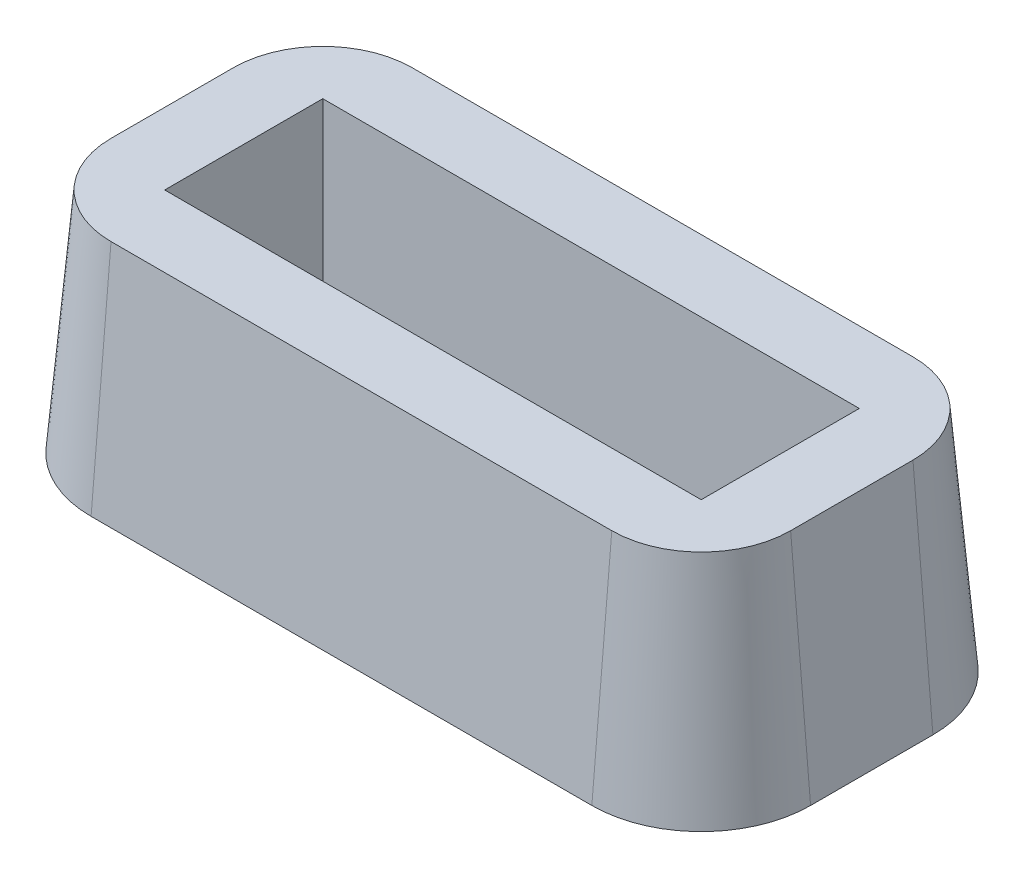
ISO-10303-21;
HEADER;
FILE_DESCRIPTION(('STEP AP214'),'2;1');
FILE_NAME('part.step','',(''),(''),'','','');
FILE_SCHEMA(('AUTOMOTIVE_DESIGN { 1 0 10303 214 1 1 1 1 }'));
ENDSEC;
DATA;
#1=APPLICATION_CONTEXT('core data for automotive mechanical design processes');
#2=APPLICATION_PROTOCOL_DEFINITION('international standard','automotive_design',2000,#1);
#3=PRODUCT_CONTEXT('',#1,'mechanical');
#4=PRODUCT('Part','Part','',(#3));
#5=PRODUCT_RELATED_PRODUCT_CATEGORY('part','',(#4));
#6=PRODUCT_DEFINITION_FORMATION('','',#4);
#7=PRODUCT_DEFINITION_CONTEXT('part definition',#1,'design');
#8=PRODUCT_DEFINITION('design','',#6,#7);
#9=PRODUCT_DEFINITION_SHAPE('','',#8);
#10=(LENGTH_UNIT() NAMED_UNIT(*) SI_UNIT(.MILLI.,.METRE.));
#11=(NAMED_UNIT(*) PLANE_ANGLE_UNIT() SI_UNIT($,.RADIAN.));
#12=(NAMED_UNIT(*) SI_UNIT($,.STERADIAN.) SOLID_ANGLE_UNIT());
#13=UNCERTAINTY_MEASURE_WITH_UNIT(LENGTH_MEASURE(1.E-05),#10,'distance_accuracy_value','');
#14=(GEOMETRIC_REPRESENTATION_CONTEXT(3) GLOBAL_UNCERTAINTY_ASSIGNED_CONTEXT((#13)) GLOBAL_UNIT_ASSIGNED_CONTEXT((#10,
#11,#12)) REPRESENTATION_CONTEXT('',''));
#15=CARTESIAN_POINT('',(0.,0.,0.));
#16=DIRECTION('',(0.,0.,1.));
#17=DIRECTION('',(1.,0.,0.));
#18=AXIS2_PLACEMENT_3D('',#15,#16,#17);
#19=CARTESIAN_POINT('',(-14.,12.75,3.42));
#20=DIRECTION('',(0.,-1.,0.));
#21=DIRECTION('',(0.,0.,-1.));
#22=AXIS2_PLACEMENT_3D('',#19,#20,#21);
#23=PLANE('',#22);
#24=CARTESIAN_POINT('',(-14.,12.75,3.42));
#25=DIRECTION('',(0.,1.,0.));
#26=DIRECTION('',(0.,0.,-1.));
#27=AXIS2_PLACEMENT_3D('',#24,#25,#26);
#28=CIRCLE('',#27,5.);
#29=CARTESIAN_POINT('',(-19.,12.75,3.42));
#30=VERTEX_POINT('',#29);
#31=CARTESIAN_POINT('',(-14.,12.75,8.42));
#32=VERTEX_POINT('',#31);
#33=EDGE_CURVE('E133',#30,#32,#28,.T.);
#34=ORIENTED_EDGE('',*,*,#33,.T.);
#35=DIRECTION('',(1.,0.,0.));
#36=VECTOR('',#35,1.);
#37=CARTESIAN_POINT('',(14.,12.75,8.42));
#38=LINE('',#37,#36);
#39=CARTESIAN_POINT('',(14.,12.75,8.42));
#40=VERTEX_POINT('',#39);
#41=EDGE_CURVE('E151',#32,#40,#38,.T.);
#42=ORIENTED_EDGE('',*,*,#41,.T.);
#43=CARTESIAN_POINT('',(14.,12.75,3.42));
#44=DIRECTION('',(0.,1.,0.));
#45=DIRECTION('',(0.,0.,1.));
#46=AXIS2_PLACEMENT_3D('',#43,#44,#45);
#47=CIRCLE('',#46,5.);
#48=CARTESIAN_POINT('',(19.,12.75,3.42));
#49=VERTEX_POINT('',#48);
#50=EDGE_CURVE('E153',#40,#49,#47,.T.);
#51=ORIENTED_EDGE('',*,*,#50,.T.);
#52=DIRECTION('',(0.,0.,-1.));
#53=VECTOR('',#52,1.);
#54=CARTESIAN_POINT('',(19.,12.75,3.42));
#55=LINE('',#54,#53);
#56=CARTESIAN_POINT('',(19.,12.75,-3.42));
#57=VERTEX_POINT('',#56);
#58=EDGE_CURVE('E162',#49,#57,#55,.T.);
#59=ORIENTED_EDGE('',*,*,#58,.T.);
#60=CARTESIAN_POINT('',(14.,12.75,-3.42));
#61=DIRECTION('',(0.,1.,0.));
#62=DIRECTION('',(0.,0.,1.));
#63=AXIS2_PLACEMENT_3D('',#60,#61,#62);
#64=CIRCLE('',#63,5.);
#65=CARTESIAN_POINT('',(14.,12.75,-8.42));
#66=VERTEX_POINT('',#65);
#67=EDGE_CURVE('E164',#57,#66,#64,.T.);
#68=ORIENTED_EDGE('',*,*,#67,.T.);
#69=DIRECTION('',(-1.,0.,0.));
#70=VECTOR('',#69,1.);
#71=CARTESIAN_POINT('',(14.,12.75,-8.42));
#72=LINE('',#71,#70);
#73=CARTESIAN_POINT('',(-14.,12.75,-8.42));
#74=VERTEX_POINT('',#73);
#75=EDGE_CURVE('E166',#66,#74,#72,.T.);
#76=ORIENTED_EDGE('',*,*,#75,.T.);
#77=CARTESIAN_POINT('',(-14.,12.75,-3.42));
#78=DIRECTION('',(0.,1.,0.));
#79=DIRECTION('',(0.,0.,1.));
#80=AXIS2_PLACEMENT_3D('',#77,#78,#79);
#81=CIRCLE('',#80,5.);
#82=CARTESIAN_POINT('',(-19.,12.75,-3.42));
#83=VERTEX_POINT('',#82);
#84=EDGE_CURVE('E136',#74,#83,#81,.T.);
#85=ORIENTED_EDGE('',*,*,#84,.T.);
#86=DIRECTION('',(0.,0.,1.));
#87=VECTOR('',#86,1.);
#88=CARTESIAN_POINT('',(-19.,12.75,3.42));
#89=LINE('',#88,#87);
#90=EDGE_CURVE('E129',#83,#30,#89,.T.);
#91=ORIENTED_EDGE('',*,*,#90,.T.);
#92=EDGE_LOOP('',(#34,#42,#51,#59,#68,#76,#85,#91));
#93=FACE_BOUND('',#92,.T.);
#94=DIRECTION('',(0.,0.,1.));
#95=VECTOR('',#94,1.);
#96=CARTESIAN_POINT('',(-15.,12.75,4.42));
#97=LINE('',#96,#95);
#98=CARTESIAN_POINT('',(-15.,12.75,-4.42));
#99=VERTEX_POINT('',#98);
#100=CARTESIAN_POINT('',(-15.,12.75,4.42));
#101=VERTEX_POINT('',#100);
#102=EDGE_CURVE('E338',#99,#101,#97,.T.);
#103=ORIENTED_EDGE('',*,*,#102,.F.);
#104=DIRECTION('',(-1.,0.,0.));
#105=VECTOR('',#104,1.);
#106=CARTESIAN_POINT('',(15.,12.75,-4.42));
#107=LINE('',#106,#105);
#108=CARTESIAN_POINT('',(15.,12.75,-4.42));
#109=VERTEX_POINT('',#108);
#110=EDGE_CURVE('E91',#109,#99,#107,.T.);
#111=ORIENTED_EDGE('',*,*,#110,.F.);
#112=DIRECTION('',(0.,0.,-1.));
#113=VECTOR('',#112,1.);
#114=CARTESIAN_POINT('',(15.,12.75,4.42));
#115=LINE('',#114,#113);
#116=CARTESIAN_POINT('',(15.,12.75,4.42));
#117=VERTEX_POINT('',#116);
#118=EDGE_CURVE('E359',#117,#109,#115,.T.);
#119=ORIENTED_EDGE('',*,*,#118,.F.);
#120=DIRECTION('',(1.,0.,0.));
#121=VECTOR('',#120,1.);
#122=CARTESIAN_POINT('',(15.,12.75,4.42));
#123=LINE('',#122,#121);
#124=EDGE_CURVE('E361',#101,#117,#123,.T.);
#125=ORIENTED_EDGE('',*,*,#124,.F.);
#126=EDGE_LOOP('',(#103,#111,#119,#125));
#127=FACE_BOUND('',#126,.T.);
#128=ADVANCED_FACE('F33',(#93,#127),#23,.F.);
#129=CARTESIAN_POINT('',(-14.,0.,3.42));
#130=DIRECTION('',(0.,-1.,0.));
#131=DIRECTION('',(0.,0.,-1.));
#132=AXIS2_PLACEMENT_3D('',#129,#130,#131);
#133=PLANE('',#132);
#134=CARTESIAN_POINT('',(-14.,0.,3.42));
#135=DIRECTION('',(0.,-1.,0.));
#136=DIRECTION('',(0.,0.,-1.));
#137=AXIS2_PLACEMENT_3D('',#134,#135,#136);
#138=CIRCLE('',#137,6.11548045995553);
#139=CARTESIAN_POINT('',(-20.1154804599555,0.,3.42));
#140=VERTEX_POINT('',#139);
#141=CARTESIAN_POINT('',(-14.,0.,9.53548045995553));
#142=VERTEX_POINT('',#141);
#143=EDGE_CURVE('E183',#140,#142,#138,.F.);
#144=ORIENTED_EDGE('',*,*,#143,.F.);
#145=DIRECTION('',(0.,0.,-1.));
#146=VECTOR('',#145,1.);
#147=CARTESIAN_POINT('',(-20.1154804599555,0.,3.42));
#148=LINE('',#147,#146);
#149=CARTESIAN_POINT('',(-20.1154804599555,0.,-3.42));
#150=VERTEX_POINT('',#149);
#151=EDGE_CURVE('E145',#150,#140,#148,.F.);
#152=ORIENTED_EDGE('',*,*,#151,.F.);
#153=CARTESIAN_POINT('',(-14.,0.,-3.42));
#154=DIRECTION('',(0.,-1.,0.));
#155=DIRECTION('',(0.,0.,-1.));
#156=AXIS2_PLACEMENT_3D('',#153,#154,#155);
#157=CIRCLE('',#156,6.11548045995553);
#158=CARTESIAN_POINT('',(-14.,0.,-9.53548045995553));
#159=VERTEX_POINT('',#158);
#160=EDGE_CURVE('E155',#159,#150,#157,.F.);
#161=ORIENTED_EDGE('',*,*,#160,.F.);
#162=DIRECTION('',(1.,0.,0.));
#163=VECTOR('',#162,1.);
#164=CARTESIAN_POINT('',(-14.,0.,-9.53548045995553));
#165=LINE('',#164,#163);
#166=CARTESIAN_POINT('',(14.,0.,-9.53548045995554));
#167=VERTEX_POINT('',#166);
#168=EDGE_CURVE('E186',#167,#159,#165,.F.);
#169=ORIENTED_EDGE('',*,*,#168,.F.);
#170=CARTESIAN_POINT('',(14.,0.,-3.42));
#171=DIRECTION('',(0.,-1.,0.));
#172=DIRECTION('',(0.,0.,-1.));
#173=AXIS2_PLACEMENT_3D('',#170,#171,#172);
#174=CIRCLE('',#173,6.11548045995554);
#175=CARTESIAN_POINT('',(20.1154804599555,0.,-3.42));
#176=VERTEX_POINT('',#175);
#177=EDGE_CURVE('E188',#176,#167,#174,.F.);
#178=ORIENTED_EDGE('',*,*,#177,.F.);
#179=DIRECTION('',(0.,0.,1.));
#180=VECTOR('',#179,1.);
#181=CARTESIAN_POINT('',(20.1154804599555,0.,3.42));
#182=LINE('',#181,#180);
#183=CARTESIAN_POINT('',(20.1154804599555,0.,3.42));
#184=VERTEX_POINT('',#183);
#185=EDGE_CURVE('E190',#184,#176,#182,.F.);
#186=ORIENTED_EDGE('',*,*,#185,.F.);
#187=CARTESIAN_POINT('',(14.,0.,3.42));
#188=DIRECTION('',(0.,-1.,0.));
#189=DIRECTION('',(0.,0.,-1.));
#190=AXIS2_PLACEMENT_3D('',#187,#188,#189);
#191=CIRCLE('',#190,6.11548045995554);
#192=CARTESIAN_POINT('',(14.,0.,9.53548045995553));
#193=VERTEX_POINT('',#192);
#194=EDGE_CURVE('E191',#193,#184,#191,.F.);
#195=ORIENTED_EDGE('',*,*,#194,.F.);
#196=DIRECTION('',(-1.,0.,0.));
#197=VECTOR('',#196,1.);
#198=CARTESIAN_POINT('',(-14.,0.,9.53548045995553));
#199=LINE('',#198,#197);
#200=EDGE_CURVE('E37',#142,#193,#199,.F.);
#201=ORIENTED_EDGE('',*,*,#200,.F.);
#202=EDGE_LOOP('',(#144,#152,#161,#169,#178,#186,#195,#201));
#203=FACE_BOUND('',#202,.T.);
#204=DIRECTION('',(-1.,0.,0.));
#205=VECTOR('',#204,1.);
#206=CARTESIAN_POINT('',(15.,0.,-4.42));
#207=LINE('',#206,#205);
#208=CARTESIAN_POINT('',(15.,0.,-4.42));
#209=VERTEX_POINT('',#208);
#210=CARTESIAN_POINT('',(-15.,0.,-4.42));
#211=VERTEX_POINT('',#210);
#212=EDGE_CURVE('E334',#209,#211,#207,.T.);
#213=ORIENTED_EDGE('',*,*,#212,.T.);
#214=DIRECTION('',(0.,0.,1.));
#215=VECTOR('',#214,1.);
#216=CARTESIAN_POINT('',(-15.,0.,4.42));
#217=LINE('',#216,#215);
#218=CARTESIAN_POINT('',(-15.,0.,4.42));
#219=VERTEX_POINT('',#218);
#220=EDGE_CURVE('E346',#211,#219,#217,.T.);
#221=ORIENTED_EDGE('',*,*,#220,.T.);
#222=DIRECTION('',(1.,0.,0.));
#223=VECTOR('',#222,1.);
#224=CARTESIAN_POINT('',(15.,0.,4.42));
#225=LINE('',#224,#223);
#226=CARTESIAN_POINT('',(15.,0.,4.42));
#227=VERTEX_POINT('',#226);
#228=EDGE_CURVE('E343',#219,#227,#225,.T.);
#229=ORIENTED_EDGE('',*,*,#228,.T.);
#230=DIRECTION('',(0.,0.,-1.));
#231=VECTOR('',#230,1.);
#232=CARTESIAN_POINT('',(15.,0.,4.42));
#233=LINE('',#232,#231);
#234=EDGE_CURVE('E339',#227,#209,#233,.T.);
#235=ORIENTED_EDGE('',*,*,#234,.T.);
#236=EDGE_LOOP('',(#213,#221,#229,#235));
#237=FACE_BOUND('',#236,.T.);
#238=ADVANCED_FACE('F202',(#203,#237),#133,.T.);
#239=CARTESIAN_POINT('',(-14.,12.75,3.42));
#240=DIRECTION('',(0.,-1.,0.));
#241=DIRECTION('',(0.,0.,-1.));
#242=AXIS2_PLACEMENT_3D('',#239,#240,#241);
#243=CONICAL_SURFACE('',#242,5.,0.0872664625997167);
#244=ORIENTED_EDGE('',*,*,#143,.T.);
#245=DIRECTION('',(0.,-0.996194698091745,0.0871557427476583));
#246=VECTOR('',#245,1.);
#247=CARTESIAN_POINT('',(-14.,12.75,8.42));
#248=LINE('',#247,#246);
#249=EDGE_CURVE('E11',#32,#142,#248,.T.);
#250=ORIENTED_EDGE('',*,*,#249,.F.);
#251=ORIENTED_EDGE('',*,*,#33,.F.);
#252=DIRECTION('',(-0.0871557427476584,-0.996194698091745,0.));
#253=VECTOR('',#252,1.);
#254=CARTESIAN_POINT('',(-19.,12.75,3.42));
#255=LINE('',#254,#253);
#256=EDGE_CURVE('E140',#30,#140,#255,.T.);
#257=ORIENTED_EDGE('',*,*,#256,.T.);
#258=EDGE_LOOP('',(#244,#250,#251,#257));
#259=FACE_BOUND('',#258,.T.);
#260=ADVANCED_FACE('F150',(#259),#243,.T.);
#261=CARTESIAN_POINT('',(14.,12.75,8.42));
#262=DIRECTION('',(0.,0.0871557427476584,0.996194698091745));
#263=DIRECTION('',(0.,-0.996194698091746,0.0871557427476584));
#264=AXIS2_PLACEMENT_3D('',#261,#262,#263);
#265=PLANE('',#264);
#266=ORIENTED_EDGE('',*,*,#200,.T.);
#267=DIRECTION('',(0.,-0.996194698091745,0.0871557427476584));
#268=VECTOR('',#267,1.);
#269=CARTESIAN_POINT('',(14.,12.75,8.42));
#270=LINE('',#269,#268);
#271=EDGE_CURVE('E43',#40,#193,#270,.T.);
#272=ORIENTED_EDGE('',*,*,#271,.F.);
#273=ORIENTED_EDGE('',*,*,#41,.F.);
#274=ORIENTED_EDGE('',*,*,#249,.T.);
#275=EDGE_LOOP('',(#266,#272,#273,#274));
#276=FACE_BOUND('',#275,.T.);
#277=ADVANCED_FACE('F35',(#276),#265,.T.);
#278=CARTESIAN_POINT('',(14.,12.75,3.42));
#279=DIRECTION('',(0.,-1.,0.));
#280=DIRECTION('',(0.,0.,1.));
#281=AXIS2_PLACEMENT_3D('',#278,#279,#280);
#282=CONICAL_SURFACE('',#281,5.,0.0872664625997167);
#283=ORIENTED_EDGE('',*,*,#194,.T.);
#284=DIRECTION('',(0.0871557427476584,-0.996194698091745,0.));
#285=VECTOR('',#284,1.);
#286=CARTESIAN_POINT('',(19.,12.75,3.42));
#287=LINE('',#286,#285);
#288=EDGE_CURVE('E179',#49,#184,#287,.T.);
#289=ORIENTED_EDGE('',*,*,#288,.F.);
#290=ORIENTED_EDGE('',*,*,#50,.F.);
#291=ORIENTED_EDGE('',*,*,#271,.T.);
#292=EDGE_LOOP('',(#283,#289,#290,#291));
#293=FACE_BOUND('',#292,.T.);
#294=ADVANCED_FACE('F194',(#293),#282,.T.);
#295=CARTESIAN_POINT('',(19.,12.75,3.42));
#296=DIRECTION('',(0.996194698091746,0.0871557427476584,0.));
#297=DIRECTION('',(-0.0871557427476584,0.996194698091746,0.));
#298=AXIS2_PLACEMENT_3D('',#295,#296,#297);
#299=PLANE('',#298);
#300=ORIENTED_EDGE('',*,*,#185,.T.);
#301=DIRECTION('',(0.0871557427476584,-0.996194698091745,0.));
#302=VECTOR('',#301,1.);
#303=CARTESIAN_POINT('',(19.,12.75,-3.42));
#304=LINE('',#303,#302);
#305=EDGE_CURVE('E176',#57,#176,#304,.T.);
#306=ORIENTED_EDGE('',*,*,#305,.F.);
#307=ORIENTED_EDGE('',*,*,#58,.F.);
#308=ORIENTED_EDGE('',*,*,#288,.T.);
#309=EDGE_LOOP('',(#300,#306,#307,#308));
#310=FACE_BOUND('',#309,.T.);
#311=ADVANCED_FACE('F199',(#310),#299,.T.);
#312=CARTESIAN_POINT('',(14.,12.75,-3.42));
#313=DIRECTION('',(0.,-1.,0.));
#314=DIRECTION('',(0.,0.,1.));
#315=AXIS2_PLACEMENT_3D('',#312,#313,#314);
#316=CONICAL_SURFACE('',#315,5.,0.0872664625997167);
#317=ORIENTED_EDGE('',*,*,#177,.T.);
#318=DIRECTION('',(0.,-0.996194698091745,-0.0871557427476583));
#319=VECTOR('',#318,1.);
#320=CARTESIAN_POINT('',(14.,12.75,-8.42));
#321=LINE('',#320,#319);
#322=EDGE_CURVE('E173',#66,#167,#321,.T.);
#323=ORIENTED_EDGE('',*,*,#322,.F.);
#324=ORIENTED_EDGE('',*,*,#67,.F.);
#325=ORIENTED_EDGE('',*,*,#305,.T.);
#326=EDGE_LOOP('',(#317,#323,#324,#325));
#327=FACE_BOUND('',#326,.T.);
#328=ADVANCED_FACE('F208',(#327),#316,.T.);
#329=CARTESIAN_POINT('',(14.,12.75,-8.42));
#330=DIRECTION('',(0.,0.0871557427476584,-0.996194698091745));
#331=DIRECTION('',(0.,0.996194698091746,0.0871557427476584));
#332=AXIS2_PLACEMENT_3D('',#329,#330,#331);
#333=PLANE('',#332);
#334=ORIENTED_EDGE('',*,*,#168,.T.);
#335=DIRECTION('',(0.,-0.996194698091745,-0.0871557427476583));
#336=VECTOR('',#335,1.);
#337=CARTESIAN_POINT('',(-14.,12.75,-8.42));
#338=LINE('',#337,#336);
#339=EDGE_CURVE('E170',#74,#159,#338,.T.);
#340=ORIENTED_EDGE('',*,*,#339,.F.);
#341=ORIENTED_EDGE('',*,*,#75,.F.);
#342=ORIENTED_EDGE('',*,*,#322,.T.);
#343=EDGE_LOOP('',(#334,#340,#341,#342));
#344=FACE_BOUND('',#343,.T.);
#345=ADVANCED_FACE('F212',(#344),#333,.T.);
#346=CARTESIAN_POINT('',(-14.,12.75,-3.42));
#347=DIRECTION('',(0.,-1.,0.));
#348=DIRECTION('',(0.,0.,1.));
#349=AXIS2_PLACEMENT_3D('',#346,#347,#348);
#350=CONICAL_SURFACE('',#349,5.,0.0872664625997167);
#351=ORIENTED_EDGE('',*,*,#160,.T.);
#352=DIRECTION('',(-0.0871557427476584,-0.996194698091745,0.));
#353=VECTOR('',#352,1.);
#354=CARTESIAN_POINT('',(-19.,12.75,-3.42));
#355=LINE('',#354,#353);
#356=EDGE_CURVE('E148',#83,#150,#355,.T.);
#357=ORIENTED_EDGE('',*,*,#356,.F.);
#358=ORIENTED_EDGE('',*,*,#84,.F.);
#359=ORIENTED_EDGE('',*,*,#339,.T.);
#360=EDGE_LOOP('',(#351,#357,#358,#359));
#361=FACE_BOUND('',#360,.T.);
#362=ADVANCED_FACE('F232',(#361),#350,.T.);
#363=CARTESIAN_POINT('',(-19.,12.75,3.42));
#364=DIRECTION('',(-0.996194698091746,0.0871557427476584,0.));
#365=DIRECTION('',(-0.0871557427476584,-0.996194698091746,0.));
#366=AXIS2_PLACEMENT_3D('',#363,#364,#365);
#367=PLANE('',#366);
#368=ORIENTED_EDGE('',*,*,#151,.T.);
#369=ORIENTED_EDGE('',*,*,#256,.F.);
#370=ORIENTED_EDGE('',*,*,#90,.F.);
#371=ORIENTED_EDGE('',*,*,#356,.T.);
#372=EDGE_LOOP('',(#368,#369,#370,#371));
#373=FACE_BOUND('',#372,.T.);
#374=ADVANCED_FACE('F143',(#373),#367,.T.);
#375=CARTESIAN_POINT('',(-15.,12.75,4.42));
#376=DIRECTION('',(1.,0.,0.));
#377=DIRECTION('',(0.,0.,-1.));
#378=AXIS2_PLACEMENT_3D('',#375,#376,#377);
#379=PLANE('',#378);
#380=ORIENTED_EDGE('',*,*,#220,.F.);
#381=DIRECTION('',(0.,-1.,0.));
#382=VECTOR('',#381,1.);
#383=CARTESIAN_POINT('',(-15.,12.75,-4.42));
#384=LINE('',#383,#382);
#385=EDGE_CURVE('E336',#99,#211,#384,.T.);
#386=ORIENTED_EDGE('',*,*,#385,.F.);
#387=ORIENTED_EDGE('',*,*,#102,.T.);
#388=DIRECTION('',(0.,-1.,0.));
#389=VECTOR('',#388,1.);
#390=CARTESIAN_POINT('',(-15.,12.75,4.42));
#391=LINE('',#390,#389);
#392=EDGE_CURVE('E158',#101,#219,#391,.T.);
#393=ORIENTED_EDGE('',*,*,#392,.T.);
#394=EDGE_LOOP('',(#380,#386,#387,#393));
#395=FACE_BOUND('',#394,.T.);
#396=ADVANCED_FACE('F227',(#395),#379,.T.);
#397=CARTESIAN_POINT('',(15.,12.75,4.42));
#398=DIRECTION('',(0.,0.,-1.));
#399=DIRECTION('',(-1.,0.,0.));
#400=AXIS2_PLACEMENT_3D('',#397,#398,#399);
#401=PLANE('',#400);
#402=ORIENTED_EDGE('',*,*,#228,.F.);
#403=ORIENTED_EDGE('',*,*,#392,.F.);
#404=ORIENTED_EDGE('',*,*,#124,.T.);
#405=DIRECTION('',(0.,-1.,0.));
#406=VECTOR('',#405,1.);
#407=CARTESIAN_POINT('',(15.,12.75,4.42));
#408=LINE('',#407,#406);
#409=EDGE_CURVE('E351',#117,#227,#408,.T.);
#410=ORIENTED_EDGE('',*,*,#409,.T.);
#411=EDGE_LOOP('',(#402,#403,#404,#410));
#412=FACE_BOUND('',#411,.T.);
#413=ADVANCED_FACE('F267',(#412),#401,.T.);
#414=CARTESIAN_POINT('',(15.,12.75,4.42));
#415=DIRECTION('',(-1.,0.,0.));
#416=DIRECTION('',(0.,0.,1.));
#417=AXIS2_PLACEMENT_3D('',#414,#415,#416);
#418=PLANE('',#417);
#419=ORIENTED_EDGE('',*,*,#234,.F.);
#420=ORIENTED_EDGE('',*,*,#409,.F.);
#421=ORIENTED_EDGE('',*,*,#118,.T.);
#422=DIRECTION('',(0.,-1.,0.));
#423=VECTOR('',#422,1.);
#424=CARTESIAN_POINT('',(15.,12.75,-4.42));
#425=LINE('',#424,#423);
#426=EDGE_CURVE('E52',#109,#209,#425,.T.);
#427=ORIENTED_EDGE('',*,*,#426,.T.);
#428=EDGE_LOOP('',(#419,#420,#421,#427));
#429=FACE_BOUND('',#428,.T.);
#430=ADVANCED_FACE('F274',(#429),#418,.T.);
#431=CARTESIAN_POINT('',(15.,12.75,-4.42));
#432=DIRECTION('',(0.,0.,1.));
#433=DIRECTION('',(1.,0.,0.));
#434=AXIS2_PLACEMENT_3D('',#431,#432,#433);
#435=PLANE('',#434);
#436=ORIENTED_EDGE('',*,*,#212,.F.);
#437=ORIENTED_EDGE('',*,*,#426,.F.);
#438=ORIENTED_EDGE('',*,*,#110,.T.);
#439=ORIENTED_EDGE('',*,*,#385,.T.);
#440=EDGE_LOOP('',(#436,#437,#438,#439));
#441=FACE_BOUND('',#440,.T.);
#442=ADVANCED_FACE('F281',(#441),#435,.T.);
#443=CLOSED_SHELL('',(#128,#238,#260,#277,#294,#311,#328,#345,#362,#374,#396,#413,#430,#442));
#444=MANIFOLD_SOLID_BREP('B2',#443);
#445=ADVANCED_BREP_SHAPE_REPRESENTATION('',(#18,#444),#14);
#446=SHAPE_DEFINITION_REPRESENTATION(#9,#445);
ENDSEC;
END-ISO-10303-21;
